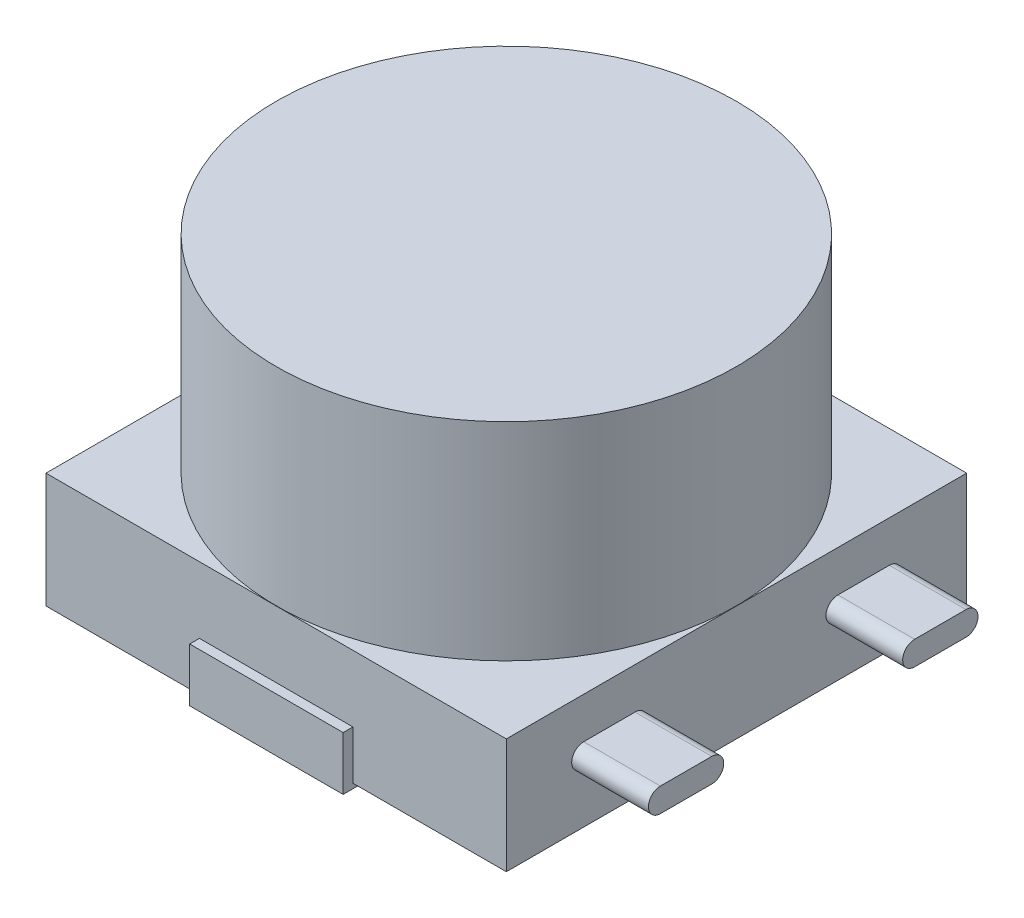
ISO-10303-21;
HEADER;
FILE_DESCRIPTION(('STEP AP214'),'2;1');
FILE_NAME('part.step','',(''),(''),'','','');
FILE_SCHEMA(('AUTOMOTIVE_DESIGN { 1 0 10303 214 1 1 1 1 }'));
ENDSEC;
DATA;
#1=APPLICATION_CONTEXT('core data for automotive mechanical design processes');
#2=APPLICATION_PROTOCOL_DEFINITION('international standard','automotive_design',2000,#1);
#3=PRODUCT_CONTEXT('',#1,'mechanical');
#4=PRODUCT('Part','Part','',(#3));
#5=PRODUCT_RELATED_PRODUCT_CATEGORY('part','',(#4));
#6=PRODUCT_DEFINITION_FORMATION('','',#4);
#7=PRODUCT_DEFINITION_CONTEXT('part definition',#1,'design');
#8=PRODUCT_DEFINITION('design','',#6,#7);
#9=PRODUCT_DEFINITION_SHAPE('','',#8);
#10=(LENGTH_UNIT() NAMED_UNIT(*) SI_UNIT(.MILLI.,.METRE.));
#11=(NAMED_UNIT(*) PLANE_ANGLE_UNIT() SI_UNIT($,.RADIAN.));
#12=(NAMED_UNIT(*) SI_UNIT($,.STERADIAN.) SOLID_ANGLE_UNIT());
#13=UNCERTAINTY_MEASURE_WITH_UNIT(LENGTH_MEASURE(1.E-05),#10,'distance_accuracy_value','');
#14=(GEOMETRIC_REPRESENTATION_CONTEXT(3) GLOBAL_UNCERTAINTY_ASSIGNED_CONTEXT((#13)) GLOBAL_UNIT_ASSIGNED_CONTEXT((#10,
#11,#12)) REPRESENTATION_CONTEXT('',''));
#15=CARTESIAN_POINT('',(0.,0.,0.));
#16=DIRECTION('',(0.,0.,1.));
#17=DIRECTION('',(1.,0.,0.));
#18=AXIS2_PLACEMENT_3D('',#15,#16,#17);
#19=CARTESIAN_POINT('',(6.,3.,-6.));
#20=DIRECTION('',(-1.,0.,0.));
#21=DIRECTION('',(0.,0.,1.));
#22=AXIS2_PLACEMENT_3D('',#19,#20,#21);
#23=PLANE('',#22);
#24=CARTESIAN_POINT('',(6.,1.61561928819216,3.98367732081085));
#25=DIRECTION('',(1.,0.,0.));
#26=DIRECTION('',(0.,0.,-1.));
#27=AXIS2_PLACEMENT_3D('',#24,#25,#26);
#28=CIRCLE('',#27,0.312051967648105);
#29=CARTESIAN_POINT('',(6.,1.92767125584027,3.98367732081085));
#30=VERTEX_POINT('',#29);
#31=CARTESIAN_POINT('',(6.,1.30356732054406,3.98367732081085));
#32=VERTEX_POINT('',#31);
#33=EDGE_CURVE('E346',#30,#32,#28,.T.);
#34=ORIENTED_EDGE('',*,*,#33,.F.);
#35=DIRECTION('',(0.,0.,1.));
#36=VECTOR('',#35,1.);
#37=CARTESIAN_POINT('',(6.,1.92767125584027,3.98367732081085));
#38=LINE('',#37,#36);
#39=CARTESIAN_POINT('',(6.,1.92767125584027,2.64445429298773));
#40=VERTEX_POINT('',#39);
#41=EDGE_CURVE('E352',#40,#30,#38,.T.);
#42=ORIENTED_EDGE('',*,*,#41,.F.);
#43=CARTESIAN_POINT('',(6.,1.61561928819216,2.64445429298773));
#44=DIRECTION('',(1.,0.,0.));
#45=DIRECTION('',(0.,0.,-1.));
#46=AXIS2_PLACEMENT_3D('',#43,#44,#45);
#47=CIRCLE('',#46,0.312051967648105);
#48=CARTESIAN_POINT('',(6.,1.30356732054406,2.64445429298773));
#49=VERTEX_POINT('',#48);
#50=EDGE_CURVE('E369',#49,#40,#47,.T.);
#51=ORIENTED_EDGE('',*,*,#50,.F.);
#52=DIRECTION('',(0.,0.,-1.));
#53=VECTOR('',#52,1.);
#54=CARTESIAN_POINT('',(6.,1.30356732054406,3.98367732081085));
#55=LINE('',#54,#53);
#56=EDGE_CURVE('E365',#32,#49,#55,.T.);
#57=ORIENTED_EDGE('',*,*,#56,.F.);
#58=EDGE_LOOP('',(#34,#42,#51,#57));
#59=FACE_BOUND('',#58,.T.);
#60=DIRECTION('',(0.,0.,-1.));
#61=VECTOR('',#60,1.);
#62=CARTESIAN_POINT('',(6.,0.,-6.));
#63=LINE('',#62,#61);
#64=CARTESIAN_POINT('',(6.,0.,6.));
#65=VERTEX_POINT('',#64);
#66=CARTESIAN_POINT('',(6.,0.,-6.));
#67=VERTEX_POINT('',#66);
#68=EDGE_CURVE('E395',#65,#67,#63,.T.);
#69=ORIENTED_EDGE('',*,*,#68,.T.);
#70=DIRECTION('',(0.,-1.,0.));
#71=VECTOR('',#70,1.);
#72=CARTESIAN_POINT('',(6.,3.,-6.));
#73=LINE('',#72,#71);
#74=CARTESIAN_POINT('',(6.,3.,-6.));
#75=VERTEX_POINT('',#74);
#76=EDGE_CURVE('E401',#75,#67,#73,.T.);
#77=ORIENTED_EDGE('',*,*,#76,.F.);
#78=DIRECTION('',(0.,0.,-1.));
#79=VECTOR('',#78,1.);
#80=CARTESIAN_POINT('',(6.,3.,-6.));
#81=LINE('',#80,#79);
#82=CARTESIAN_POINT('',(6.,3.,6.));
#83=VERTEX_POINT('',#82);
#84=EDGE_CURVE('E402',#83,#75,#81,.T.);
#85=ORIENTED_EDGE('',*,*,#84,.F.);
#86=DIRECTION('',(0.,-1.,0.));
#87=VECTOR('',#86,1.);
#88=CARTESIAN_POINT('',(6.,3.,6.));
#89=LINE('',#88,#87);
#90=EDGE_CURVE('E416',#83,#65,#89,.T.);
#91=ORIENTED_EDGE('',*,*,#90,.T.);
#92=EDGE_LOOP('',(#69,#77,#85,#91));
#93=FACE_BOUND('',#92,.T.);
#94=CARTESIAN_POINT('',(6.,1.61561928819216,-3.98367732081085));
#95=DIRECTION('',(1.,0.,0.));
#96=DIRECTION('',(0.,0.,1.));
#97=AXIS2_PLACEMENT_3D('',#94,#95,#96);
#98=CIRCLE('',#97,0.312051967648105);
#99=CARTESIAN_POINT('',(6.,1.30356732054406,-3.98367732081085));
#100=VERTEX_POINT('',#99);
#101=CARTESIAN_POINT('',(6.,1.92767125584027,-3.98367732081085));
#102=VERTEX_POINT('',#101);
#103=EDGE_CURVE('E301',#100,#102,#98,.T.);
#104=ORIENTED_EDGE('',*,*,#103,.F.);
#105=DIRECTION('',(0.,0.,-1.));
#106=VECTOR('',#105,1.);
#107=CARTESIAN_POINT('',(6.,1.30356732054406,-3.98367732081085));
#108=LINE('',#107,#106);
#109=CARTESIAN_POINT('',(6.,1.30356732054406,-2.64445429298773));
#110=VERTEX_POINT('',#109);
#111=EDGE_CURVE('E307',#110,#100,#108,.T.);
#112=ORIENTED_EDGE('',*,*,#111,.F.);
#113=CARTESIAN_POINT('',(6.,1.61561928819216,-2.64445429298773));
#114=DIRECTION('',(1.,0.,0.));
#115=DIRECTION('',(0.,0.,1.));
#116=AXIS2_PLACEMENT_3D('',#113,#114,#115);
#117=CIRCLE('',#116,0.312051967648105);
#118=CARTESIAN_POINT('',(6.,1.92767125584027,-2.64445429298773));
#119=VERTEX_POINT('',#118);
#120=EDGE_CURVE('E324',#119,#110,#117,.T.);
#121=ORIENTED_EDGE('',*,*,#120,.F.);
#122=DIRECTION('',(0.,0.,1.));
#123=VECTOR('',#122,1.);
#124=CARTESIAN_POINT('',(6.,1.92767125584027,-3.98367732081085));
#125=LINE('',#124,#123);
#126=EDGE_CURVE('E320',#102,#119,#125,.T.);
#127=ORIENTED_EDGE('',*,*,#126,.F.);
#128=EDGE_LOOP('',(#104,#112,#121,#127));
#129=FACE_BOUND('',#128,.T.);
#130=ADVANCED_FACE('F39',(#59,#93,#129),#23,.F.);
#131=CARTESIAN_POINT('',(-6.,3.,-6.));
#132=DIRECTION('',(0.,0.,1.));
#133=DIRECTION('',(1.,0.,0.));
#134=AXIS2_PLACEMENT_3D('',#131,#132,#133);
#135=PLANE('',#134);
#136=DIRECTION('',(1.,0.,0.));
#137=VECTOR('',#136,1.);
#138=CARTESIAN_POINT('',(-6.,1.27,-6.));
#139=LINE('',#138,#137);
#140=CARTESIAN_POINT('',(-2.,1.27,-6.));
#141=VERTEX_POINT('',#140);
#142=CARTESIAN_POINT('',(2.,1.27,-6.));
#143=VERTEX_POINT('',#142);
#144=EDGE_CURVE('E11',#141,#143,#139,.T.);
#145=ORIENTED_EDGE('',*,*,#144,.F.);
#146=DIRECTION('',(0.,-1.,0.));
#147=VECTOR('',#146,1.);
#148=CARTESIAN_POINT('',(-2.,3.,-6.));
#149=LINE('',#148,#147);
#150=CARTESIAN_POINT('',(-2.,0.,-6.));
#151=VERTEX_POINT('',#150);
#152=EDGE_CURVE('E251',#141,#151,#149,.T.);
#153=ORIENTED_EDGE('',*,*,#152,.T.);
#154=DIRECTION('',(-1.,0.,0.));
#155=VECTOR('',#154,1.);
#156=CARTESIAN_POINT('',(-6.,0.,-6.));
#157=LINE('',#156,#155);
#158=CARTESIAN_POINT('',(-6.,0.,-6.));
#159=VERTEX_POINT('',#158);
#160=EDGE_CURVE('E420',#151,#159,#157,.T.);
#161=ORIENTED_EDGE('',*,*,#160,.T.);
#162=DIRECTION('',(0.,-1.,0.));
#163=VECTOR('',#162,1.);
#164=CARTESIAN_POINT('',(-6.,3.,-6.));
#165=LINE('',#164,#163);
#166=CARTESIAN_POINT('',(-6.,3.,-6.));
#167=VERTEX_POINT('',#166);
#168=EDGE_CURVE('E439',#167,#159,#165,.T.);
#169=ORIENTED_EDGE('',*,*,#168,.F.);
#170=DIRECTION('',(-1.,0.,0.));
#171=VECTOR('',#170,1.);
#172=CARTESIAN_POINT('',(-6.,3.,-6.));
#173=LINE('',#172,#171);
#174=EDGE_CURVE('E406',#75,#167,#173,.T.);
#175=ORIENTED_EDGE('',*,*,#174,.F.);
#176=ORIENTED_EDGE('',*,*,#76,.T.);
#177=CARTESIAN_POINT('',(2.,0.,-6.));
#178=VERTEX_POINT('',#177);
#179=EDGE_CURVE('E421',#67,#178,#157,.T.);
#180=ORIENTED_EDGE('',*,*,#179,.T.);
#181=DIRECTION('',(0.,1.,0.));
#182=VECTOR('',#181,1.);
#183=CARTESIAN_POINT('',(2.,3.,-6.));
#184=LINE('',#183,#182);
#185=EDGE_CURVE('E54',#178,#143,#184,.T.);
#186=ORIENTED_EDGE('',*,*,#185,.T.);
#187=EDGE_LOOP('',(#145,#153,#161,#169,#175,#176,#180,#186));
#188=FACE_BOUND('',#187,.T.);
#189=ADVANCED_FACE('F478',(#188),#135,.F.);
#190=CARTESIAN_POINT('',(-6.,3.,-6.));
#191=DIRECTION('',(1.,0.,0.));
#192=DIRECTION('',(0.,0.,-1.));
#193=AXIS2_PLACEMENT_3D('',#190,#191,#192);
#194=PLANE('',#193);
#195=DIRECTION('',(0.,0.,1.));
#196=VECTOR('',#195,1.);
#197=CARTESIAN_POINT('',(-6.,0.,-6.));
#198=LINE('',#197,#196);
#199=CARTESIAN_POINT('',(-6.,0.,6.));
#200=VERTEX_POINT('',#199);
#201=EDGE_CURVE('E425',#159,#200,#198,.T.);
#202=ORIENTED_EDGE('',*,*,#201,.T.);
#203=DIRECTION('',(0.,-1.,0.));
#204=VECTOR('',#203,1.);
#205=CARTESIAN_POINT('',(-6.,3.,6.));
#206=LINE('',#205,#204);
#207=CARTESIAN_POINT('',(-6.,3.,6.));
#208=VERTEX_POINT('',#207);
#209=EDGE_CURVE('E435',#208,#200,#206,.T.);
#210=ORIENTED_EDGE('',*,*,#209,.F.);
#211=DIRECTION('',(0.,0.,1.));
#212=VECTOR('',#211,1.);
#213=CARTESIAN_POINT('',(-6.,3.,-6.));
#214=LINE('',#213,#212);
#215=EDGE_CURVE('E410',#167,#208,#214,.T.);
#216=ORIENTED_EDGE('',*,*,#215,.F.);
#217=ORIENTED_EDGE('',*,*,#168,.T.);
#218=EDGE_LOOP('',(#202,#210,#216,#217));
#219=FACE_BOUND('',#218,.T.);
#220=ADVANCED_FACE('F500',(#219),#194,.F.);
#221=CARTESIAN_POINT('',(-6.,3.,6.));
#222=DIRECTION('',(0.,0.,-1.));
#223=DIRECTION('',(-1.,0.,0.));
#224=AXIS2_PLACEMENT_3D('',#221,#222,#223);
#225=PLANE('',#224);
#226=DIRECTION('',(1.,0.,0.));
#227=VECTOR('',#226,1.);
#228=CARTESIAN_POINT('',(-6.,0.,6.));
#229=LINE('',#228,#227);
#230=CARTESIAN_POINT('',(-2.,0.,6.));
#231=VERTEX_POINT('',#230);
#232=EDGE_CURVE('E407',#200,#231,#229,.T.);
#233=ORIENTED_EDGE('',*,*,#232,.T.);
#234=DIRECTION('',(0.,1.,0.));
#235=VECTOR('',#234,1.);
#236=CARTESIAN_POINT('',(-2.,3.,6.));
#237=LINE('',#236,#235);
#238=CARTESIAN_POINT('',(-2.,1.27,6.));
#239=VERTEX_POINT('',#238);
#240=EDGE_CURVE('E297',#231,#239,#237,.T.);
#241=ORIENTED_EDGE('',*,*,#240,.T.);
#242=DIRECTION('',(-1.,0.,0.));
#243=VECTOR('',#242,1.);
#244=CARTESIAN_POINT('',(-6.,1.27,6.));
#245=LINE('',#244,#243);
#246=CARTESIAN_POINT('',(2.,1.27,6.));
#247=VERTEX_POINT('',#246);
#248=EDGE_CURVE('E457',#247,#239,#245,.T.);
#249=ORIENTED_EDGE('',*,*,#248,.F.);
#250=DIRECTION('',(0.,-1.,0.));
#251=VECTOR('',#250,1.);
#252=CARTESIAN_POINT('',(2.,3.,6.));
#253=LINE('',#252,#251);
#254=CARTESIAN_POINT('',(2.,0.,6.));
#255=VERTEX_POINT('',#254);
#256=EDGE_CURVE('E285',#247,#255,#253,.T.);
#257=ORIENTED_EDGE('',*,*,#256,.T.);
#258=EDGE_CURVE('E428',#255,#65,#229,.T.);
#259=ORIENTED_EDGE('',*,*,#258,.T.);
#260=ORIENTED_EDGE('',*,*,#90,.F.);
#261=DIRECTION('',(1.,0.,0.));
#262=VECTOR('',#261,1.);
#263=CARTESIAN_POINT('',(-6.,3.,6.));
#264=LINE('',#263,#262);
#265=EDGE_CURVE('E413',#208,#83,#264,.T.);
#266=ORIENTED_EDGE('',*,*,#265,.F.);
#267=ORIENTED_EDGE('',*,*,#209,.T.);
#268=EDGE_LOOP('',(#233,#241,#249,#257,#259,#260,#266,#267));
#269=FACE_BOUND('',#268,.T.);
#270=ADVANCED_FACE('F563',(#269),#225,.F.);
#271=CARTESIAN_POINT('',(0.,3.,0.));
#272=DIRECTION('',(0.,1.,0.));
#273=DIRECTION('',(0.,0.,1.));
#274=AXIS2_PLACEMENT_3D('',#271,#272,#273);
#275=PLANE('',#274);
#276=CARTESIAN_POINT('',(0.,3.,0.));
#277=DIRECTION('',(0.,1.,0.));
#278=DIRECTION('',(0.,0.,1.));
#279=AXIS2_PLACEMENT_3D('',#276,#277,#278);
#280=CIRCLE('',#279,5.99527769222872);
#281=CARTESIAN_POINT('',(0.,3.,-5.99527769222872));
#282=VERTEX_POINT('',#281);
#283=EDGE_CURVE('E396',#282,#282,#280,.T.);
#284=ORIENTED_EDGE('',*,*,#283,.F.);
#285=EDGE_LOOP('',(#284));
#286=FACE_BOUND('',#285,.T.);
#287=ORIENTED_EDGE('',*,*,#84,.T.);
#288=ORIENTED_EDGE('',*,*,#174,.T.);
#289=ORIENTED_EDGE('',*,*,#215,.T.);
#290=ORIENTED_EDGE('',*,*,#265,.T.);
#291=EDGE_LOOP('',(#287,#288,#289,#290));
#292=FACE_BOUND('',#291,.T.);
#293=ADVANCED_FACE('F560',(#286,#292),#275,.T.);
#294=CARTESIAN_POINT('',(0.,0.,0.));
#295=DIRECTION('',(0.,1.,0.));
#296=DIRECTION('',(0.,0.,1.));
#297=AXIS2_PLACEMENT_3D('',#294,#295,#296);
#298=PLANE('',#297);
#299=ORIENTED_EDGE('',*,*,#160,.F.);
#300=DIRECTION('',(0.,0.,1.));
#301=VECTOR('',#300,1.);
#302=CARTESIAN_POINT('',(-2.,0.,0.));
#303=LINE('',#302,#301);
#304=CARTESIAN_POINT('',(-2.,0.,-3.254));
#305=VERTEX_POINT('',#304);
#306=EDGE_CURVE('E47',#151,#305,#303,.T.);
#307=ORIENTED_EDGE('',*,*,#306,.T.);
#308=DIRECTION('',(1.,0.,0.));
#309=VECTOR('',#308,1.);
#310=CARTESIAN_POINT('',(0.,0.,-3.254));
#311=LINE('',#310,#309);
#312=CARTESIAN_POINT('',(2.,0.,-3.254));
#313=VERTEX_POINT('',#312);
#314=EDGE_CURVE('E463',#305,#313,#311,.T.);
#315=ORIENTED_EDGE('',*,*,#314,.T.);
#316=DIRECTION('',(0.,0.,-1.));
#317=VECTOR('',#316,1.);
#318=CARTESIAN_POINT('',(2.,0.,0.));
#319=LINE('',#318,#317);
#320=EDGE_CURVE('E460',#313,#178,#319,.T.);
#321=ORIENTED_EDGE('',*,*,#320,.T.);
#322=ORIENTED_EDGE('',*,*,#179,.F.);
#323=ORIENTED_EDGE('',*,*,#68,.F.);
#324=ORIENTED_EDGE('',*,*,#258,.F.);
#325=DIRECTION('',(0.,0.,-1.));
#326=VECTOR('',#325,1.);
#327=CARTESIAN_POINT('',(2.,0.,0.));
#328=LINE('',#327,#326);
#329=CARTESIAN_POINT('',(2.,0.,3.254));
#330=VERTEX_POINT('',#329);
#331=EDGE_CURVE('E449',#255,#330,#328,.T.);
#332=ORIENTED_EDGE('',*,*,#331,.T.);
#333=DIRECTION('',(-1.,0.,0.));
#334=VECTOR('',#333,1.);
#335=CARTESIAN_POINT('',(0.,0.,3.254));
#336=LINE('',#335,#334);
#337=CARTESIAN_POINT('',(-2.,0.,3.254));
#338=VERTEX_POINT('',#337);
#339=EDGE_CURVE('E400',#330,#338,#336,.T.);
#340=ORIENTED_EDGE('',*,*,#339,.T.);
#341=DIRECTION('',(0.,0.,1.));
#342=VECTOR('',#341,1.);
#343=CARTESIAN_POINT('',(-2.,0.,0.));
#344=LINE('',#343,#342);
#345=EDGE_CURVE('E453',#338,#231,#344,.T.);
#346=ORIENTED_EDGE('',*,*,#345,.T.);
#347=ORIENTED_EDGE('',*,*,#232,.F.);
#348=ORIENTED_EDGE('',*,*,#201,.F.);
#349=EDGE_LOOP('',(#299,#307,#315,#321,#322,#323,#324,#332,#340,#346,#347,#348));
#350=FACE_BOUND('',#349,.T.);
#351=ADVANCED_FACE('F470',(#350),#298,.F.);
#352=CARTESIAN_POINT('',(0.,8.4,0.));
#353=DIRECTION('',(0.,-1.,0.));
#354=DIRECTION('',(0.,0.,-1.));
#355=AXIS2_PLACEMENT_3D('',#352,#353,#354);
#356=CYLINDRICAL_SURFACE('',#355,5.99527769222872);
#357=CARTESIAN_POINT('',(0.,8.4,0.));
#358=DIRECTION('',(0.,1.,0.));
#359=DIRECTION('',(0.,0.,1.));
#360=AXIS2_PLACEMENT_3D('',#357,#358,#359);
#361=CIRCLE('',#360,5.99527769222872);
#362=CARTESIAN_POINT('',(0.,8.4,-5.99527769222872));
#363=VERTEX_POINT('',#362);
#364=EDGE_CURVE('E391',#363,#363,#361,.T.);
#365=CARTESIAN_POINT('',(0.,8.4,-5.99527769222872));
#366=CARTESIAN_POINT('',(0.,8.34375,-5.99527769222872));
#367=CARTESIAN_POINT('',(0.,8.2875,-5.99527769222872));
#368=CARTESIAN_POINT('',(0.,8.175,-5.99527769222872));
#369=CARTESIAN_POINT('',(0.,8.11875,-5.99527769222872));
#370=CARTESIAN_POINT('',(0.,8.00625,-5.99527769222872));
#371=CARTESIAN_POINT('',(0.,7.95,-5.99527769222872));
#372=CARTESIAN_POINT('',(0.,7.8375,-5.99527769222872));
#373=CARTESIAN_POINT('',(0.,7.78125,-5.99527769222872));
#374=CARTESIAN_POINT('',(0.,7.66875,-5.99527769222872));
#375=CARTESIAN_POINT('',(0.,7.6125,-5.99527769222872));
#376=CARTESIAN_POINT('',(0.,7.5,-5.99527769222872));
#377=CARTESIAN_POINT('',(0.,7.44375,-5.99527769222872));
#378=CARTESIAN_POINT('',(0.,7.33125,-5.99527769222872));
#379=CARTESIAN_POINT('',(0.,7.275,-5.99527769222872));
#380=CARTESIAN_POINT('',(0.,7.1625,-5.99527769222872));
#381=CARTESIAN_POINT('',(0.,7.10625,-5.99527769222872));
#382=CARTESIAN_POINT('',(0.,6.99375,-5.99527769222872));
#383=CARTESIAN_POINT('',(0.,6.9375,-5.99527769222872));
#384=CARTESIAN_POINT('',(0.,6.825,-5.99527769222872));
#385=CARTESIAN_POINT('',(0.,6.76875,-5.99527769222872));
#386=CARTESIAN_POINT('',(0.,6.65625,-5.99527769222872));
#387=CARTESIAN_POINT('',(0.,6.6,-5.99527769222872));
#388=CARTESIAN_POINT('',(0.,6.4875,-5.99527769222872));
#389=CARTESIAN_POINT('',(0.,6.43125,-5.99527769222872));
#390=CARTESIAN_POINT('',(0.,6.31875,-5.99527769222872));
#391=CARTESIAN_POINT('',(0.,6.2625,-5.99527769222872));
#392=CARTESIAN_POINT('',(0.,6.15,-5.99527769222872));
#393=CARTESIAN_POINT('',(0.,6.09375,-5.99527769222872));
#394=CARTESIAN_POINT('',(0.,5.98125,-5.99527769222872));
#395=CARTESIAN_POINT('',(0.,5.925,-5.99527769222872));
#396=CARTESIAN_POINT('',(0.,5.8125,-5.99527769222872));
#397=CARTESIAN_POINT('',(0.,5.75625,-5.99527769222872));
#398=CARTESIAN_POINT('',(0.,5.64375,-5.99527769222872));
#399=CARTESIAN_POINT('',(0.,5.5875,-5.99527769222872));
#400=CARTESIAN_POINT('',(0.,5.475,-5.99527769222872));
#401=CARTESIAN_POINT('',(0.,5.41875,-5.99527769222872));
#402=CARTESIAN_POINT('',(0.,5.30625,-5.99527769222872));
#403=CARTESIAN_POINT('',(0.,5.25,-5.99527769222872));
#404=CARTESIAN_POINT('',(0.,5.1375,-5.99527769222872));
#405=CARTESIAN_POINT('',(0.,5.08125,-5.99527769222872));
#406=CARTESIAN_POINT('',(0.,4.96875,-5.99527769222872));
#407=CARTESIAN_POINT('',(0.,4.9125,-5.99527769222872));
#408=CARTESIAN_POINT('',(0.,4.8,-5.99527769222872));
#409=CARTESIAN_POINT('',(0.,4.74375,-5.99527769222872));
#410=CARTESIAN_POINT('',(0.,4.63125,-5.99527769222872));
#411=CARTESIAN_POINT('',(0.,4.575,-5.99527769222872));
#412=CARTESIAN_POINT('',(0.,4.4625,-5.99527769222872));
#413=CARTESIAN_POINT('',(0.,4.40625,-5.99527769222872));
#414=CARTESIAN_POINT('',(0.,4.29375,-5.99527769222872));
#415=CARTESIAN_POINT('',(0.,4.2375,-5.99527769222872));
#416=CARTESIAN_POINT('',(0.,4.125,-5.99527769222872));
#417=CARTESIAN_POINT('',(0.,4.06875,-5.99527769222872));
#418=CARTESIAN_POINT('',(0.,3.95625,-5.99527769222872));
#419=CARTESIAN_POINT('',(0.,3.9,-5.99527769222872));
#420=CARTESIAN_POINT('',(0.,3.7875,-5.99527769222872));
#421=CARTESIAN_POINT('',(0.,3.73125,-5.99527769222872));
#422=CARTESIAN_POINT('',(0.,3.61875,-5.99527769222872));
#423=CARTESIAN_POINT('',(0.,3.5625,-5.99527769222872));
#424=CARTESIAN_POINT('',(0.,3.45,-5.99527769222872));
#425=CARTESIAN_POINT('',(0.,3.39375,-5.99527769222872));
#426=CARTESIAN_POINT('',(0.,3.28125,-5.99527769222872));
#427=CARTESIAN_POINT('',(0.,3.225,-5.99527769222872));
#428=CARTESIAN_POINT('',(0.,3.1125,-5.99527769222872));
#429=CARTESIAN_POINT('',(0.,3.05625,-5.99527769222872));
#430=CARTESIAN_POINT('',(0.,3.,-5.99527769222872));
#431=B_SPLINE_CURVE_WITH_KNOTS('',3,(#365,#366,#367,#368,#369,#370,#371,#372,#373,#374,#375,
#376,#377,#378,#379,#380,#381,#382,#383,#384,#385,#386,#387,#388,#389,#390,#391,#392,#393,#394,
#395,#396,#397,#398,#399,#400,#401,#402,#403,#404,#405,#406,#407,#408,#409,#410,#411,#412,#413,
#414,#415,#416,#417,#418,#419,#420,#421,#422,#423,#424,#425,#426,#427,#428,#429,#430),
.UNSPECIFIED.,.F.,.F.,(4,2,2,2,2,2,2,2,2,2,2,2,2,2,2,2,2,2,2,2,2,2,2,2,2,2,2,2,2,2,2,2,4),(0.,
0.168750000000001,0.337500000000001,0.506250000000002,0.675000000000001,0.843750000000001,
1.0125,1.18125,1.35,1.51875,1.6875,1.85625,2.025,2.19375,2.3625,2.53125,2.7,2.86875,3.0375,
3.20625,3.375,3.54375,3.7125,3.88125,4.05,4.21875,4.3875,4.55625,4.725,4.89375,5.0625,5.23125,
5.4),.UNSPECIFIED.);
#432=EDGE_CURVE('BSEAM555',#363,#282,#431,.T.);
#433=ORIENTED_EDGE('',*,*,#364,.F.);
#434=ORIENTED_EDGE('',*,*,#283,.T.);
#435=ORIENTED_EDGE('',*,*,#432,.T.);
#436=ORIENTED_EDGE('',*,*,#432,.F.);
#437=EDGE_LOOP('',(#433,#435,#434,#436));
#438=FACE_BOUND('',#437,.T.);
#439=ADVANCED_FACE('F555',(#438),#356,.T.);
#440=CARTESIAN_POINT('',(0.,8.4,0.));
#441=DIRECTION('',(0.,1.,0.));
#442=DIRECTION('',(0.,0.,1.));
#443=AXIS2_PLACEMENT_3D('',#440,#441,#442);
#444=PLANE('',#443);
#445=ORIENTED_EDGE('',*,*,#364,.T.);
#446=EDGE_LOOP('',(#445));
#447=FACE_BOUND('',#446,.T.);
#448=ADVANCED_FACE('F551',(#447),#444,.T.);
#449=CARTESIAN_POINT('',(8.,1.61561928819216,3.98367732081085));
#450=DIRECTION('',(-1.,0.,0.));
#451=DIRECTION('',(0.,0.,1.));
#452=AXIS2_PLACEMENT_3D('',#449,#450,#451);
#453=CYLINDRICAL_SURFACE('',#452,0.312051967648105);
#454=ORIENTED_EDGE('',*,*,#33,.T.);
#455=DIRECTION('',(-1.,0.,0.));
#456=VECTOR('',#455,1.);
#457=CARTESIAN_POINT('',(8.,1.30356732054406,3.98367732081085));
#458=LINE('',#457,#456);
#459=CARTESIAN_POINT('',(8.,1.30356732054406,3.98367732081085));
#460=VERTEX_POINT('',#459);
#461=EDGE_CURVE('E387',#460,#32,#458,.T.);
#462=ORIENTED_EDGE('',*,*,#461,.F.);
#463=CARTESIAN_POINT('',(8.,1.61561928819216,3.98367732081085));
#464=DIRECTION('',(1.,0.,0.));
#465=DIRECTION('',(0.,0.,-1.));
#466=AXIS2_PLACEMENT_3D('',#463,#464,#465);
#467=CIRCLE('',#466,0.312051967648105);
#468=CARTESIAN_POINT('',(8.,1.92767125584027,3.98367732081085));
#469=VERTEX_POINT('',#468);
#470=EDGE_CURVE('E347',#469,#460,#467,.T.);
#471=ORIENTED_EDGE('',*,*,#470,.F.);
#472=DIRECTION('',(-1.,0.,0.));
#473=VECTOR('',#472,1.);
#474=CARTESIAN_POINT('',(8.,1.92767125584027,3.98367732081085));
#475=LINE('',#474,#473);
#476=EDGE_CURVE('E361',#469,#30,#475,.T.);
#477=ORIENTED_EDGE('',*,*,#476,.T.);
#478=EDGE_LOOP('',(#454,#462,#471,#477));
#479=FACE_BOUND('',#478,.T.);
#480=ADVANCED_FACE('F547',(#479),#453,.T.);
#481=CARTESIAN_POINT('',(8.,1.30356732054406,3.98367732081085));
#482=DIRECTION('',(0.,1.,0.));
#483=DIRECTION('',(0.,0.,1.));
#484=AXIS2_PLACEMENT_3D('',#481,#482,#483);
#485=PLANE('',#484);
#486=ORIENTED_EDGE('',*,*,#56,.T.);
#487=DIRECTION('',(-1.,0.,0.));
#488=VECTOR('',#487,1.);
#489=CARTESIAN_POINT('',(8.,1.30356732054406,2.64445429298773));
#490=LINE('',#489,#488);
#491=CARTESIAN_POINT('',(8.,1.30356732054406,2.64445429298773));
#492=VERTEX_POINT('',#491);
#493=EDGE_CURVE('E383',#492,#49,#490,.T.);
#494=ORIENTED_EDGE('',*,*,#493,.F.);
#495=DIRECTION('',(0.,0.,-1.));
#496=VECTOR('',#495,1.);
#497=CARTESIAN_POINT('',(8.,1.30356732054406,3.98367732081085));
#498=LINE('',#497,#496);
#499=EDGE_CURVE('E351',#460,#492,#498,.T.);
#500=ORIENTED_EDGE('',*,*,#499,.F.);
#501=ORIENTED_EDGE('',*,*,#461,.T.);
#502=EDGE_LOOP('',(#486,#494,#500,#501));
#503=FACE_BOUND('',#502,.T.);
#504=ADVANCED_FACE('F543',(#503),#485,.F.);
#505=CARTESIAN_POINT('',(8.,1.61561928819216,2.64445429298773));
#506=DIRECTION('',(-1.,0.,0.));
#507=DIRECTION('',(0.,0.,1.));
#508=AXIS2_PLACEMENT_3D('',#505,#506,#507);
#509=CYLINDRICAL_SURFACE('',#508,0.312051967648105);
#510=ORIENTED_EDGE('',*,*,#50,.T.);
#511=DIRECTION('',(-1.,0.,0.));
#512=VECTOR('',#511,1.);
#513=CARTESIAN_POINT('',(8.,1.92767125584027,2.64445429298773));
#514=LINE('',#513,#512);
#515=CARTESIAN_POINT('',(8.,1.92767125584027,2.64445429298773));
#516=VERTEX_POINT('',#515);
#517=EDGE_CURVE('E379',#516,#40,#514,.T.);
#518=ORIENTED_EDGE('',*,*,#517,.F.);
#519=CARTESIAN_POINT('',(8.,1.61561928819216,2.64445429298773));
#520=DIRECTION('',(1.,0.,0.));
#521=DIRECTION('',(0.,0.,-1.));
#522=AXIS2_PLACEMENT_3D('',#519,#520,#521);
#523=CIRCLE('',#522,0.312051967648105);
#524=EDGE_CURVE('E355',#492,#516,#523,.T.);
#525=ORIENTED_EDGE('',*,*,#524,.F.);
#526=ORIENTED_EDGE('',*,*,#493,.T.);
#527=EDGE_LOOP('',(#510,#518,#525,#526));
#528=FACE_BOUND('',#527,.T.);
#529=ADVANCED_FACE('F539',(#528),#509,.T.);
#530=CARTESIAN_POINT('',(8.,1.92767125584027,3.98367732081085));
#531=DIRECTION('',(0.,-1.,0.));
#532=DIRECTION('',(0.,0.,-1.));
#533=AXIS2_PLACEMENT_3D('',#530,#531,#532);
#534=PLANE('',#533);
#535=ORIENTED_EDGE('',*,*,#41,.T.);
#536=ORIENTED_EDGE('',*,*,#476,.F.);
#537=DIRECTION('',(0.,0.,1.));
#538=VECTOR('',#537,1.);
#539=CARTESIAN_POINT('',(8.,1.92767125584027,3.98367732081085));
#540=LINE('',#539,#538);
#541=EDGE_CURVE('E358',#516,#469,#540,.T.);
#542=ORIENTED_EDGE('',*,*,#541,.F.);
#543=ORIENTED_EDGE('',*,*,#517,.T.);
#544=EDGE_LOOP('',(#535,#536,#542,#543));
#545=FACE_BOUND('',#544,.T.);
#546=ADVANCED_FACE('F535',(#545),#534,.F.);
#547=CARTESIAN_POINT('',(8.,1.61561928819216,3.98367732081085));
#548=DIRECTION('',(1.,0.,0.));
#549=DIRECTION('',(0.,0.,-1.));
#550=AXIS2_PLACEMENT_3D('',#547,#548,#549);
#551=PLANE('',#550);
#552=ORIENTED_EDGE('',*,*,#470,.T.);
#553=ORIENTED_EDGE('',*,*,#499,.T.);
#554=ORIENTED_EDGE('',*,*,#524,.T.);
#555=ORIENTED_EDGE('',*,*,#541,.T.);
#556=EDGE_LOOP('',(#552,#553,#554,#555));
#557=FACE_BOUND('',#556,.T.);
#558=ADVANCED_FACE('F529',(#557),#551,.T.);
#559=CARTESIAN_POINT('',(8.,1.61561928819216,-3.98367732081085));
#560=DIRECTION('',(-1.,0.,0.));
#561=DIRECTION('',(0.,0.,1.));
#562=AXIS2_PLACEMENT_3D('',#559,#560,#561);
#563=CYLINDRICAL_SURFACE('',#562,0.312051967648105);
#564=ORIENTED_EDGE('',*,*,#103,.T.);
#565=DIRECTION('',(-1.,0.,0.));
#566=VECTOR('',#565,1.);
#567=CARTESIAN_POINT('',(8.,1.92767125584027,-3.98367732081085));
#568=LINE('',#567,#566);
#569=CARTESIAN_POINT('',(8.,1.92767125584027,-3.98367732081085));
#570=VERTEX_POINT('',#569);
#571=EDGE_CURVE('E342',#570,#102,#568,.T.);
#572=ORIENTED_EDGE('',*,*,#571,.F.);
#573=CARTESIAN_POINT('',(8.,1.61561928819216,-3.98367732081085));
#574=DIRECTION('',(1.,0.,0.));
#575=DIRECTION('',(0.,0.,1.));
#576=AXIS2_PLACEMENT_3D('',#573,#574,#575);
#577=CIRCLE('',#576,0.312051967648105);
#578=CARTESIAN_POINT('',(8.,1.30356732054406,-3.98367732081085));
#579=VERTEX_POINT('',#578);
#580=EDGE_CURVE('E302',#579,#570,#577,.T.);
#581=ORIENTED_EDGE('',*,*,#580,.F.);
#582=DIRECTION('',(-1.,0.,0.));
#583=VECTOR('',#582,1.);
#584=CARTESIAN_POINT('',(8.,1.30356732054406,-3.98367732081085));
#585=LINE('',#584,#583);
#586=EDGE_CURVE('E316',#579,#100,#585,.T.);
#587=ORIENTED_EDGE('',*,*,#586,.T.);
#588=EDGE_LOOP('',(#564,#572,#581,#587));
#589=FACE_BOUND('',#588,.T.);
#590=ADVANCED_FACE('F513',(#589),#563,.T.);
#591=CARTESIAN_POINT('',(8.,1.92767125584027,-3.98367732081085));
#592=DIRECTION('',(0.,-1.,0.));
#593=DIRECTION('',(0.,0.,-1.));
#594=AXIS2_PLACEMENT_3D('',#591,#592,#593);
#595=PLANE('',#594);
#596=ORIENTED_EDGE('',*,*,#126,.T.);
#597=DIRECTION('',(-1.,0.,0.));
#598=VECTOR('',#597,1.);
#599=CARTESIAN_POINT('',(8.,1.92767125584027,-2.64445429298773));
#600=LINE('',#599,#598);
#601=CARTESIAN_POINT('',(8.,1.92767125584027,-2.64445429298773));
#602=VERTEX_POINT('',#601);
#603=EDGE_CURVE('E338',#602,#119,#600,.T.);
#604=ORIENTED_EDGE('',*,*,#603,.F.);
#605=DIRECTION('',(0.,0.,1.));
#606=VECTOR('',#605,1.);
#607=CARTESIAN_POINT('',(8.,1.92767125584027,-3.98367732081085));
#608=LINE('',#607,#606);
#609=EDGE_CURVE('E306',#570,#602,#608,.T.);
#610=ORIENTED_EDGE('',*,*,#609,.F.);
#611=ORIENTED_EDGE('',*,*,#571,.T.);
#612=EDGE_LOOP('',(#596,#604,#610,#611));
#613=FACE_BOUND('',#612,.T.);
#614=ADVANCED_FACE('F521',(#613),#595,.F.);
#615=CARTESIAN_POINT('',(8.,1.61561928819216,-2.64445429298773));
#616=DIRECTION('',(-1.,0.,0.));
#617=DIRECTION('',(0.,0.,1.));
#618=AXIS2_PLACEMENT_3D('',#615,#616,#617);
#619=CYLINDRICAL_SURFACE('',#618,0.312051967648105);
#620=ORIENTED_EDGE('',*,*,#120,.T.);
#621=DIRECTION('',(-1.,0.,0.));
#622=VECTOR('',#621,1.);
#623=CARTESIAN_POINT('',(8.,1.30356732054406,-2.64445429298773));
#624=LINE('',#623,#622);
#625=CARTESIAN_POINT('',(8.,1.30356732054406,-2.64445429298773));
#626=VERTEX_POINT('',#625);
#627=EDGE_CURVE('E334',#626,#110,#624,.T.);
#628=ORIENTED_EDGE('',*,*,#627,.F.);
#629=CARTESIAN_POINT('',(8.,1.61561928819216,-2.64445429298773));
#630=DIRECTION('',(1.,0.,0.));
#631=DIRECTION('',(0.,0.,1.));
#632=AXIS2_PLACEMENT_3D('',#629,#630,#631);
#633=CIRCLE('',#632,0.312051967648105);
#634=EDGE_CURVE('E310',#602,#626,#633,.T.);
#635=ORIENTED_EDGE('',*,*,#634,.F.);
#636=ORIENTED_EDGE('',*,*,#603,.T.);
#637=EDGE_LOOP('',(#620,#628,#635,#636));
#638=FACE_BOUND('',#637,.T.);
#639=ADVANCED_FACE('F519',(#638),#619,.T.);
#640=CARTESIAN_POINT('',(8.,1.30356732054406,-3.98367732081085));
#641=DIRECTION('',(0.,1.,0.));
#642=DIRECTION('',(0.,0.,1.));
#643=AXIS2_PLACEMENT_3D('',#640,#641,#642);
#644=PLANE('',#643);
#645=ORIENTED_EDGE('',*,*,#111,.T.);
#646=ORIENTED_EDGE('',*,*,#586,.F.);
#647=DIRECTION('',(0.,0.,-1.));
#648=VECTOR('',#647,1.);
#649=CARTESIAN_POINT('',(8.,1.30356732054406,-3.98367732081085));
#650=LINE('',#649,#648);
#651=EDGE_CURVE('E313',#626,#579,#650,.T.);
#652=ORIENTED_EDGE('',*,*,#651,.F.);
#653=ORIENTED_EDGE('',*,*,#627,.T.);
#654=EDGE_LOOP('',(#645,#646,#652,#653));
#655=FACE_BOUND('',#654,.T.);
#656=ADVANCED_FACE('F509',(#655),#644,.F.);
#657=CARTESIAN_POINT('',(8.,1.61561928819216,-3.98367732081085));
#658=DIRECTION('',(-1.,0.,0.));
#659=DIRECTION('',(0.,0.,1.));
#660=AXIS2_PLACEMENT_3D('',#657,#658,#659);
#661=PLANE('',#660);
#662=ORIENTED_EDGE('',*,*,#580,.T.);
#663=ORIENTED_EDGE('',*,*,#609,.T.);
#664=ORIENTED_EDGE('',*,*,#634,.T.);
#665=ORIENTED_EDGE('',*,*,#651,.T.);
#666=EDGE_LOOP('',(#662,#663,#664,#665));
#667=FACE_BOUND('',#666,.T.);
#668=ADVANCED_FACE('F515',(#667),#661,.F.);
#669=CARTESIAN_POINT('',(0.,1.27,0.));
#670=DIRECTION('',(0.,-1.,0.));
#671=DIRECTION('',(0.,0.,-1.));
#672=AXIS2_PLACEMENT_3D('',#669,#670,#671);
#673=PLANE('',#672);
#674=DIRECTION('',(0.,0.,1.));
#675=VECTOR('',#674,1.);
#676=CARTESIAN_POINT('',(2.,1.27,6.254));
#677=LINE('',#676,#675);
#678=CARTESIAN_POINT('',(2.,1.27,6.254));
#679=VERTEX_POINT('',#678);
#680=EDGE_CURVE('E275',#247,#679,#677,.T.);
#681=ORIENTED_EDGE('',*,*,#680,.F.);
#682=ORIENTED_EDGE('',*,*,#248,.T.);
#683=DIRECTION('',(0.,0.,-1.));
#684=VECTOR('',#683,1.);
#685=CARTESIAN_POINT('',(-2.,1.27,6.254));
#686=LINE('',#685,#684);
#687=CARTESIAN_POINT('',(-2.,1.27,6.254));
#688=VERTEX_POINT('',#687);
#689=EDGE_CURVE('E271',#688,#239,#686,.T.);
#690=ORIENTED_EDGE('',*,*,#689,.F.);
#691=DIRECTION('',(-1.,0.,0.));
#692=VECTOR('',#691,1.);
#693=CARTESIAN_POINT('',(-2.,1.27,6.254));
#694=LINE('',#693,#692);
#695=EDGE_CURVE('E278',#679,#688,#694,.T.);
#696=ORIENTED_EDGE('',*,*,#695,.F.);
#697=EDGE_LOOP('',(#681,#682,#690,#696));
#698=FACE_BOUND('',#697,.T.);
#699=ADVANCED_FACE('F587',(#698),#673,.F.);
#700=CARTESIAN_POINT('',(-2.,1.27,6.254));
#701=DIRECTION('',(-1.,0.,0.));
#702=DIRECTION('',(0.,0.,1.));
#703=AXIS2_PLACEMENT_3D('',#700,#701,#702);
#704=PLANE('',#703);
#705=ORIENTED_EDGE('',*,*,#240,.F.);
#706=ORIENTED_EDGE('',*,*,#345,.F.);
#707=DIRECTION('',(0.,-1.,0.));
#708=VECTOR('',#707,1.);
#709=CARTESIAN_POINT('',(-2.,1.27,3.254));
#710=LINE('',#709,#708);
#711=CARTESIAN_POINT('',(-2.,-0.127,3.254));
#712=VERTEX_POINT('',#711);
#713=EDGE_CURVE('E62',#338,#712,#710,.T.);
#714=ORIENTED_EDGE('',*,*,#713,.T.);
#715=DIRECTION('',(0.,0.,-1.));
#716=VECTOR('',#715,1.);
#717=CARTESIAN_POINT('',(-2.,-0.127,6.254));
#718=LINE('',#717,#716);
#719=CARTESIAN_POINT('',(-2.,-0.127,6.254));
#720=VERTEX_POINT('',#719);
#721=EDGE_CURVE('E255',#720,#712,#718,.T.);
#722=ORIENTED_EDGE('',*,*,#721,.F.);
#723=DIRECTION('',(0.,-1.,0.));
#724=VECTOR('',#723,1.);
#725=CARTESIAN_POINT('',(-2.,1.27,6.254));
#726=LINE('',#725,#724);
#727=EDGE_CURVE('E282',#688,#720,#726,.T.);
#728=ORIENTED_EDGE('',*,*,#727,.F.);
#729=ORIENTED_EDGE('',*,*,#689,.T.);
#730=EDGE_LOOP('',(#705,#706,#714,#722,#728,#729));
#731=FACE_BOUND('',#730,.T.);
#732=ADVANCED_FACE('F580',(#731),#704,.T.);
#733=CARTESIAN_POINT('',(2.,1.27,6.254));
#734=DIRECTION('',(1.,0.,0.));
#735=DIRECTION('',(0.,0.,-1.));
#736=AXIS2_PLACEMENT_3D('',#733,#734,#735);
#737=PLANE('',#736);
#738=ORIENTED_EDGE('',*,*,#256,.F.);
#739=ORIENTED_EDGE('',*,*,#680,.T.);
#740=DIRECTION('',(0.,-1.,0.));
#741=VECTOR('',#740,1.);
#742=CARTESIAN_POINT('',(2.,1.27,6.254));
#743=LINE('',#742,#741);
#744=CARTESIAN_POINT('',(2.,-0.127,6.254));
#745=VERTEX_POINT('',#744);
#746=EDGE_CURVE('E286',#679,#745,#743,.T.);
#747=ORIENTED_EDGE('',*,*,#746,.T.);
#748=DIRECTION('',(0.,0.,1.));
#749=VECTOR('',#748,1.);
#750=CARTESIAN_POINT('',(2.,-0.127,6.254));
#751=LINE('',#750,#749);
#752=CARTESIAN_POINT('',(2.,-0.127,3.254));
#753=VERTEX_POINT('',#752);
#754=EDGE_CURVE('E263',#753,#745,#751,.T.);
#755=ORIENTED_EDGE('',*,*,#754,.F.);
#756=DIRECTION('',(0.,-1.,0.));
#757=VECTOR('',#756,1.);
#758=CARTESIAN_POINT('',(2.,1.27,3.254));
#759=LINE('',#758,#757);
#760=EDGE_CURVE('E289',#330,#753,#759,.T.);
#761=ORIENTED_EDGE('',*,*,#760,.F.);
#762=ORIENTED_EDGE('',*,*,#331,.F.);
#763=EDGE_LOOP('',(#738,#739,#747,#755,#761,#762));
#764=FACE_BOUND('',#763,.T.);
#765=ADVANCED_FACE('F591',(#764),#737,.T.);
#766=CARTESIAN_POINT('',(-2.,1.27,3.254));
#767=DIRECTION('',(0.,0.,-1.));
#768=DIRECTION('',(-1.,0.,0.));
#769=AXIS2_PLACEMENT_3D('',#766,#767,#768);
#770=PLANE('',#769);
#771=ORIENTED_EDGE('',*,*,#339,.F.);
#772=ORIENTED_EDGE('',*,*,#760,.T.);
#773=DIRECTION('',(1.,0.,0.));
#774=VECTOR('',#773,1.);
#775=CARTESIAN_POINT('',(-2.,-0.127,3.254));
#776=LINE('',#775,#774);
#777=EDGE_CURVE('E259',#712,#753,#776,.T.);
#778=ORIENTED_EDGE('',*,*,#777,.F.);
#779=ORIENTED_EDGE('',*,*,#713,.F.);
#780=EDGE_LOOP('',(#771,#772,#778,#779));
#781=FACE_BOUND('',#780,.T.);
#782=ADVANCED_FACE('F614',(#781),#770,.T.);
#783=CARTESIAN_POINT('',(-2.,1.27,6.254));
#784=DIRECTION('',(0.,0.,1.));
#785=DIRECTION('',(1.,0.,0.));
#786=AXIS2_PLACEMENT_3D('',#783,#784,#785);
#787=PLANE('',#786);
#788=ORIENTED_EDGE('',*,*,#727,.T.);
#789=DIRECTION('',(-1.,0.,0.));
#790=VECTOR('',#789,1.);
#791=CARTESIAN_POINT('',(-2.,-0.127,6.254));
#792=LINE('',#791,#790);
#793=EDGE_CURVE('E267',#745,#720,#792,.T.);
#794=ORIENTED_EDGE('',*,*,#793,.F.);
#795=ORIENTED_EDGE('',*,*,#746,.F.);
#796=ORIENTED_EDGE('',*,*,#695,.T.);
#797=EDGE_LOOP('',(#788,#794,#795,#796));
#798=FACE_BOUND('',#797,.T.);
#799=ADVANCED_FACE('F491',(#798),#787,.T.);
#800=CARTESIAN_POINT('',(0.,-0.127,0.));
#801=DIRECTION('',(0.,-1.,0.));
#802=DIRECTION('',(0.,0.,-1.));
#803=AXIS2_PLACEMENT_3D('',#800,#801,#802);
#804=PLANE('',#803);
#805=ORIENTED_EDGE('',*,*,#721,.T.);
#806=ORIENTED_EDGE('',*,*,#777,.T.);
#807=ORIENTED_EDGE('',*,*,#754,.T.);
#808=ORIENTED_EDGE('',*,*,#793,.T.);
#809=EDGE_LOOP('',(#805,#806,#807,#808));
#810=FACE_BOUND('',#809,.T.);
#811=ADVANCED_FACE('F483',(#810),#804,.T.);
#812=CARTESIAN_POINT('',(0.,1.27,0.));
#813=DIRECTION('',(0.,-1.,0.));
#814=DIRECTION('',(0.,0.,-1.));
#815=AXIS2_PLACEMENT_3D('',#812,#813,#814);
#816=PLANE('',#815);
#817=DIRECTION('',(0.,0.,-1.));
#818=VECTOR('',#817,1.);
#819=CARTESIAN_POINT('',(-2.,1.27,-6.254));
#820=LINE('',#819,#818);
#821=CARTESIAN_POINT('',(-2.,1.27,-6.254));
#822=VERTEX_POINT('',#821);
#823=EDGE_CURVE('E211',#141,#822,#820,.T.);
#824=ORIENTED_EDGE('',*,*,#823,.F.);
#825=ORIENTED_EDGE('',*,*,#144,.T.);
#826=DIRECTION('',(0.,0.,1.));
#827=VECTOR('',#826,1.);
#828=CARTESIAN_POINT('',(2.,1.27,-6.254));
#829=LINE('',#828,#827);
#830=CARTESIAN_POINT('',(2.,1.27,-6.254));
#831=VERTEX_POINT('',#830);
#832=EDGE_CURVE('E236',#831,#143,#829,.T.);
#833=ORIENTED_EDGE('',*,*,#832,.F.);
#834=DIRECTION('',(1.,0.,0.));
#835=VECTOR('',#834,1.);
#836=CARTESIAN_POINT('',(-2.,1.27,-6.254));
#837=LINE('',#836,#835);
#838=EDGE_CURVE('E207',#822,#831,#837,.T.);
#839=ORIENTED_EDGE('',*,*,#838,.F.);
#840=EDGE_LOOP('',(#824,#825,#833,#839));
#841=FACE_BOUND('',#840,.T.);
#842=ADVANCED_FACE('F481',(#841),#816,.F.);
#843=CARTESIAN_POINT('',(-2.,1.27,-6.254));
#844=DIRECTION('',(-1.,0.,0.));
#845=DIRECTION('',(0.,0.,1.));
#846=AXIS2_PLACEMENT_3D('',#843,#844,#845);
#847=PLANE('',#846);
#848=ORIENTED_EDGE('',*,*,#152,.F.);
#849=ORIENTED_EDGE('',*,*,#823,.T.);
#850=DIRECTION('',(0.,-1.,0.));
#851=VECTOR('',#850,1.);
#852=CARTESIAN_POINT('',(-2.,1.27,-6.254));
#853=LINE('',#852,#851);
#854=CARTESIAN_POINT('',(-2.,-0.127,-6.254));
#855=VERTEX_POINT('',#854);
#856=EDGE_CURVE('E241',#822,#855,#853,.T.);
#857=ORIENTED_EDGE('',*,*,#856,.T.);
#858=DIRECTION('',(0.,0.,-1.));
#859=VECTOR('',#858,1.);
#860=CARTESIAN_POINT('',(-2.,-0.127,-6.254));
#861=LINE('',#860,#859);
#862=CARTESIAN_POINT('',(-2.,-0.127,-3.254));
#863=VERTEX_POINT('',#862);
#864=EDGE_CURVE('E226',#863,#855,#861,.T.);
#865=ORIENTED_EDGE('',*,*,#864,.F.);
#866=DIRECTION('',(0.,-1.,0.));
#867=VECTOR('',#866,1.);
#868=CARTESIAN_POINT('',(-2.,1.27,-3.254));
#869=LINE('',#868,#867);
#870=EDGE_CURVE('E244',#305,#863,#869,.T.);
#871=ORIENTED_EDGE('',*,*,#870,.F.);
#872=ORIENTED_EDGE('',*,*,#306,.F.);
#873=EDGE_LOOP('',(#848,#849,#857,#865,#871,#872));
#874=FACE_BOUND('',#873,.T.);
#875=ADVANCED_FACE('F474',(#874),#847,.T.);
#876=CARTESIAN_POINT('',(-2.,1.27,-3.254));
#877=DIRECTION('',(0.,0.,1.));
#878=DIRECTION('',(1.,0.,0.));
#879=AXIS2_PLACEMENT_3D('',#876,#877,#878);
#880=PLANE('',#879);
#881=ORIENTED_EDGE('',*,*,#314,.F.);
#882=ORIENTED_EDGE('',*,*,#870,.T.);
#883=DIRECTION('',(-1.,0.,0.));
#884=VECTOR('',#883,1.);
#885=CARTESIAN_POINT('',(-2.,-0.127,-3.254));
#886=LINE('',#885,#884);
#887=CARTESIAN_POINT('',(2.,-0.127,-3.254));
#888=VERTEX_POINT('',#887);
#889=EDGE_CURVE('E221',#888,#863,#886,.T.);
#890=ORIENTED_EDGE('',*,*,#889,.F.);
#891=DIRECTION('',(0.,-1.,0.));
#892=VECTOR('',#891,1.);
#893=CARTESIAN_POINT('',(2.,1.27,-3.254));
#894=LINE('',#893,#892);
#895=EDGE_CURVE('E210',#313,#888,#894,.T.);
#896=ORIENTED_EDGE('',*,*,#895,.F.);
#897=EDGE_LOOP('',(#881,#882,#890,#896));
#898=FACE_BOUND('',#897,.T.);
#899=ADVANCED_FACE('F489',(#898),#880,.T.);
#900=CARTESIAN_POINT('',(2.,1.27,-6.254));
#901=DIRECTION('',(1.,0.,0.));
#902=DIRECTION('',(0.,0.,-1.));
#903=AXIS2_PLACEMENT_3D('',#900,#901,#902);
#904=PLANE('',#903);
#905=ORIENTED_EDGE('',*,*,#185,.F.);
#906=ORIENTED_EDGE('',*,*,#320,.F.);
#907=ORIENTED_EDGE('',*,*,#895,.T.);
#908=DIRECTION('',(0.,0.,1.));
#909=VECTOR('',#908,1.);
#910=CARTESIAN_POINT('',(2.,-0.127,-6.254));
#911=LINE('',#910,#909);
#912=CARTESIAN_POINT('',(2.,-0.127,-6.254));
#913=VERTEX_POINT('',#912);
#914=EDGE_CURVE('E214',#913,#888,#911,.T.);
#915=ORIENTED_EDGE('',*,*,#914,.F.);
#916=DIRECTION('',(0.,-1.,0.));
#917=VECTOR('',#916,1.);
#918=CARTESIAN_POINT('',(2.,1.27,-6.254));
#919=LINE('',#918,#917);
#920=EDGE_CURVE('E200',#831,#913,#919,.T.);
#921=ORIENTED_EDGE('',*,*,#920,.F.);
#922=ORIENTED_EDGE('',*,*,#832,.T.);
#923=EDGE_LOOP('',(#905,#906,#907,#915,#921,#922));
#924=FACE_BOUND('',#923,.T.);
#925=ADVANCED_FACE('F215',(#924),#904,.T.);
#926=CARTESIAN_POINT('',(-2.,1.27,-6.254));
#927=DIRECTION('',(0.,0.,-1.));
#928=DIRECTION('',(-1.,0.,0.));
#929=AXIS2_PLACEMENT_3D('',#926,#927,#928);
#930=PLANE('',#929);
#931=ORIENTED_EDGE('',*,*,#920,.T.);
#932=DIRECTION('',(1.,0.,0.));
#933=VECTOR('',#932,1.);
#934=CARTESIAN_POINT('',(-2.,-0.127,-6.254));
#935=LINE('',#934,#933);
#936=EDGE_CURVE('E205',#855,#913,#935,.T.);
#937=ORIENTED_EDGE('',*,*,#936,.F.);
#938=ORIENTED_EDGE('',*,*,#856,.F.);
#939=ORIENTED_EDGE('',*,*,#838,.T.);
#940=EDGE_LOOP('',(#931,#937,#938,#939));
#941=FACE_BOUND('',#940,.T.);
#942=ADVANCED_FACE('F202',(#941),#930,.T.);
#943=CARTESIAN_POINT('',(0.,-0.127,0.));
#944=DIRECTION('',(0.,-1.,0.));
#945=DIRECTION('',(0.,0.,-1.));
#946=AXIS2_PLACEMENT_3D('',#943,#944,#945);
#947=PLANE('',#946);
#948=ORIENTED_EDGE('',*,*,#936,.T.);
#949=ORIENTED_EDGE('',*,*,#914,.T.);
#950=ORIENTED_EDGE('',*,*,#889,.T.);
#951=ORIENTED_EDGE('',*,*,#864,.T.);
#952=EDGE_LOOP('',(#948,#949,#950,#951));
#953=FACE_BOUND('',#952,.T.);
#954=ADVANCED_FACE('F224',(#953),#947,.T.);
#955=CLOSED_SHELL('',(#130,#189,#220,#270,#293,#351,#439,#448,#480,#504,#529,#546,#558,#590,
#614,#639,#656,#668,#699,#732,#765,#782,#799,#811,#842,#875,#899,#925,#942,#954));
#956=MANIFOLD_SOLID_BREP('B2',#955);
#957=ADVANCED_BREP_SHAPE_REPRESENTATION('',(#18,#956),#14);
#958=SHAPE_DEFINITION_REPRESENTATION(#9,#957);
ENDSEC;
END-ISO-10303-21;
